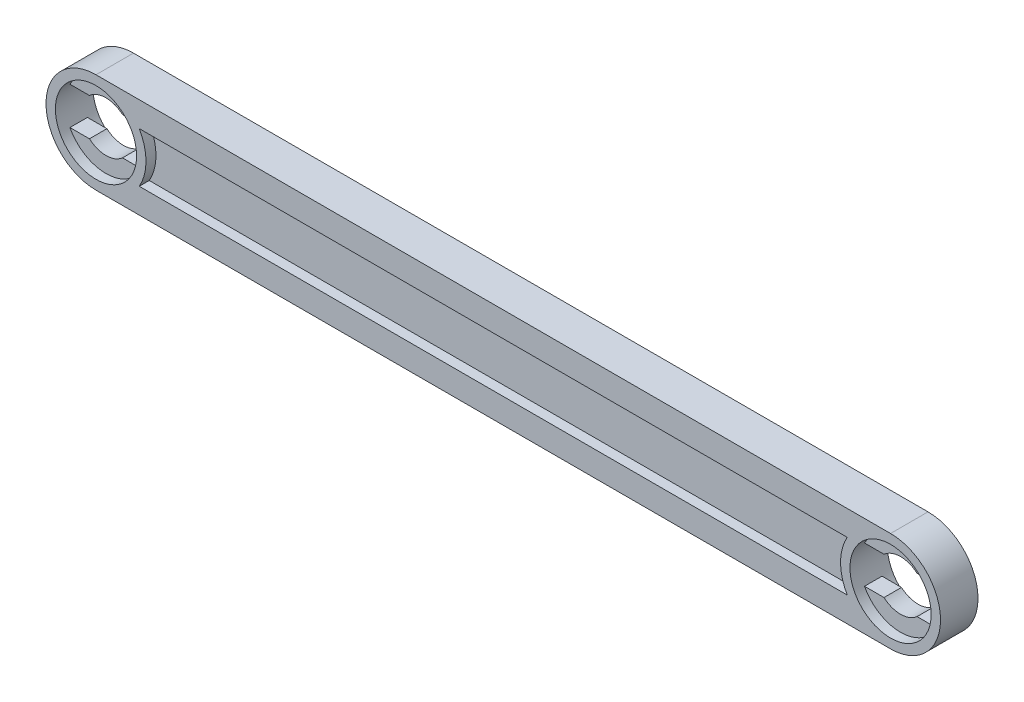
ISO-10303-21;
HEADER;
FILE_DESCRIPTION(('STEP AP214'),'2;1');
FILE_NAME('part.step','',(''),(''),'','','');
FILE_SCHEMA(('AUTOMOTIVE_DESIGN { 1 0 10303 214 1 1 1 1 }'));
ENDSEC;
DATA;
#1=APPLICATION_CONTEXT('core data for automotive mechanical design processes');
#2=APPLICATION_PROTOCOL_DEFINITION('international standard','automotive_design',2000,#1);
#3=PRODUCT_CONTEXT('',#1,'mechanical');
#4=PRODUCT('Part','Part','',(#3));
#5=PRODUCT_RELATED_PRODUCT_CATEGORY('part','',(#4));
#6=PRODUCT_DEFINITION_FORMATION('','',#4);
#7=PRODUCT_DEFINITION_CONTEXT('part definition',#1,'design');
#8=PRODUCT_DEFINITION('design','',#6,#7);
#9=PRODUCT_DEFINITION_SHAPE('','',#8);
#10=(LENGTH_UNIT() NAMED_UNIT(*) SI_UNIT(.MILLI.,.METRE.));
#11=(NAMED_UNIT(*) PLANE_ANGLE_UNIT() SI_UNIT($,.RADIAN.));
#12=(NAMED_UNIT(*) SI_UNIT($,.STERADIAN.) SOLID_ANGLE_UNIT());
#13=UNCERTAINTY_MEASURE_WITH_UNIT(LENGTH_MEASURE(1.E-05),#10,'distance_accuracy_value','');
#14=(GEOMETRIC_REPRESENTATION_CONTEXT(3) GLOBAL_UNCERTAINTY_ASSIGNED_CONTEXT((#13)) GLOBAL_UNIT_ASSIGNED_CONTEXT((#10,
#11,#12)) REPRESENTATION_CONTEXT('',''));
#15=CARTESIAN_POINT('',(0.,0.,0.));
#16=DIRECTION('',(0.,0.,1.));
#17=DIRECTION('',(1.,0.,0.));
#18=AXIS2_PLACEMENT_3D('',#15,#16,#17);
#19=CARTESIAN_POINT('',(0.,0.,-3.));
#20=DIRECTION('',(0.,0.,1.));
#21=DIRECTION('',(1.,0.,0.));
#22=AXIS2_PLACEMENT_3D('',#19,#20,#21);
#23=PLANE('',#22);
#24=DIRECTION('',(0.,-1.,0.));
#25=VECTOR('',#24,1.);
#26=CARTESIAN_POINT('',(59.6,-2.,-3.));
#27=LINE('',#26,#25);
#28=CARTESIAN_POINT('',(59.6,2.,-3.));
#29=VERTEX_POINT('',#28);
#30=CARTESIAN_POINT('',(59.6,-2.,-3.));
#31=VERTEX_POINT('',#30);
#32=EDGE_CURVE('E248',#29,#31,#27,.T.);
#33=ORIENTED_EDGE('',*,*,#32,.F.);
#34=DIRECTION('',(1.,0.,0.));
#35=VECTOR('',#34,1.);
#36=CARTESIAN_POINT('',(59.6,2.,-3.));
#37=LINE('',#36,#35);
#38=CARTESIAN_POINT('',(4.,2.,-3.));
#39=VERTEX_POINT('',#38);
#40=EDGE_CURVE('E49',#39,#29,#37,.T.);
#41=ORIENTED_EDGE('',*,*,#40,.F.);
#42=DIRECTION('',(0.,1.,0.));
#43=VECTOR('',#42,1.);
#44=CARTESIAN_POINT('',(4.00000000000003,-2.,-3.));
#45=LINE('',#44,#43);
#46=CARTESIAN_POINT('',(4.00000000000003,-2.,-3.));
#47=VERTEX_POINT('',#46);
#48=EDGE_CURVE('E239',#47,#39,#45,.T.);
#49=ORIENTED_EDGE('',*,*,#48,.F.);
#50=DIRECTION('',(-1.,0.,0.));
#51=VECTOR('',#50,1.);
#52=CARTESIAN_POINT('',(59.6,-2.,-3.));
#53=LINE('',#52,#51);
#54=EDGE_CURVE('E242',#31,#47,#53,.T.);
#55=ORIENTED_EDGE('',*,*,#54,.F.);
#56=EDGE_LOOP('',(#33,#41,#49,#55));
#57=FACE_BOUND('',#56,.T.);
#58=CARTESIAN_POINT('',(0.,0.,-3.));
#59=DIRECTION('',(0.,0.,1.));
#60=DIRECTION('',(1.,0.,0.));
#61=AXIS2_PLACEMENT_3D('',#58,#59,#60);
#62=CIRCLE('',#61,4.);
#63=CARTESIAN_POINT('',(0.,4.,-3.));
#64=VERTEX_POINT('',#63);
#65=CARTESIAN_POINT('',(0.,-4.,-3.));
#66=VERTEX_POINT('',#65);
#67=EDGE_CURVE('E414',#64,#66,#62,.T.);
#68=ORIENTED_EDGE('',*,*,#67,.F.);
#69=DIRECTION('',(-1.,0.,0.));
#70=VECTOR('',#69,1.);
#71=CARTESIAN_POINT('',(0.,4.,-3.));
#72=LINE('',#71,#70);
#73=CARTESIAN_POINT('',(63.6,4.,-3.));
#74=VERTEX_POINT('',#73);
#75=EDGE_CURVE('E424',#74,#64,#72,.T.);
#76=ORIENTED_EDGE('',*,*,#75,.F.);
#77=CARTESIAN_POINT('',(63.6,0.,-3.));
#78=DIRECTION('',(0.,0.,1.));
#79=DIRECTION('',(1.,0.,0.));
#80=AXIS2_PLACEMENT_3D('',#77,#78,#79);
#81=CIRCLE('',#80,4.);
#82=CARTESIAN_POINT('',(63.6,-4.,-3.));
#83=VERTEX_POINT('',#82);
#84=EDGE_CURVE('E421',#83,#74,#81,.T.);
#85=ORIENTED_EDGE('',*,*,#84,.F.);
#86=DIRECTION('',(1.,0.,0.));
#87=VECTOR('',#86,1.);
#88=CARTESIAN_POINT('',(0.,-4.,-3.));
#89=LINE('',#88,#87);
#90=EDGE_CURVE('E417',#66,#83,#89,.T.);
#91=ORIENTED_EDGE('',*,*,#90,.F.);
#92=EDGE_LOOP('',(#68,#76,#85,#91));
#93=FACE_BOUND('',#92,.T.);
#94=CARTESIAN_POINT('',(0.,0.,-3.));
#95=DIRECTION('',(0.,0.,1.));
#96=DIRECTION('',(1.,0.,0.));
#97=AXIS2_PLACEMENT_3D('',#94,#95,#96);
#98=CIRCLE('',#97,3.25);
#99=CARTESIAN_POINT('',(3.25,0.,-3.));
#100=VERTEX_POINT('',#99);
#101=EDGE_CURVE('E391',#100,#100,#98,.F.);
#102=ORIENTED_EDGE('',*,*,#101,.F.);
#103=EDGE_LOOP('',(#102));
#104=FACE_BOUND('',#103,.T.);
#105=CARTESIAN_POINT('',(63.6,0.,-3.));
#106=DIRECTION('',(0.,0.,1.));
#107=DIRECTION('',(1.,0.,0.));
#108=AXIS2_PLACEMENT_3D('',#105,#106,#107);
#109=CIRCLE('',#108,3.25);
#110=CARTESIAN_POINT('',(66.85,0.,-3.));
#111=VERTEX_POINT('',#110);
#112=EDGE_CURVE('E328',#111,#111,#109,.F.);
#113=ORIENTED_EDGE('',*,*,#112,.F.);
#114=EDGE_LOOP('',(#113));
#115=FACE_BOUND('',#114,.T.);
#116=ADVANCED_FACE('F34',(#57,#93,#104,#115),#23,.F.);
#117=CARTESIAN_POINT('',(60.7168593513323,1.5,-3.001));
#118=DIRECTION('',(0.,1.,0.));
#119=DIRECTION('',(0.,0.,1.));
#120=AXIS2_PLACEMENT_3D('',#117,#118,#119);
#121=PLANE('',#120);
#122=DIRECTION('',(0.,0.,1.));
#123=VECTOR('',#122,1.);
#124=CARTESIAN_POINT('',(60.7168593513323,1.5,-3.001));
#125=LINE('',#124,#123);
#126=CARTESIAN_POINT('',(60.7168593513323,1.5,-2.2));
#127=VERTEX_POINT('',#126);
#128=CARTESIAN_POINT('',(60.7168593513323,1.5,-0.8));
#129=VERTEX_POINT('',#128);
#130=EDGE_CURVE('E335',#127,#129,#125,.T.);
#131=ORIENTED_EDGE('',*,*,#130,.F.);
#132=DIRECTION('',(1.,0.,0.));
#133=VECTOR('',#132,1.);
#134=CARTESIAN_POINT('',(60.7168593513323,1.5,-2.2));
#135=LINE('',#134,#133);
#136=CARTESIAN_POINT('',(62.2771243444677,1.5,-2.2));
#137=VERTEX_POINT('',#136);
#138=EDGE_CURVE('E306',#127,#137,#135,.T.);
#139=ORIENTED_EDGE('',*,*,#138,.T.);
#140=DIRECTION('',(0.,0.,1.));
#141=VECTOR('',#140,1.);
#142=CARTESIAN_POINT('',(62.2771243444677,1.5,-3.001));
#143=LINE('',#142,#141);
#144=CARTESIAN_POINT('',(62.2771243444677,1.5,-0.8));
#145=VERTEX_POINT('',#144);
#146=EDGE_CURVE('E338',#137,#145,#143,.T.);
#147=ORIENTED_EDGE('',*,*,#146,.T.);
#148=DIRECTION('',(1.,0.,0.));
#149=VECTOR('',#148,1.);
#150=CARTESIAN_POINT('',(60.7168593513323,1.5,-0.8));
#151=LINE('',#150,#149);
#152=EDGE_CURVE('E325',#129,#145,#151,.T.);
#153=ORIENTED_EDGE('',*,*,#152,.F.);
#154=EDGE_LOOP('',(#131,#139,#147,#153));
#155=FACE_BOUND('',#154,.T.);
#156=ADVANCED_FACE('F483',(#155),#121,.F.);
#157=CARTESIAN_POINT('',(63.6,0.,-3.001));
#158=DIRECTION('',(0.,0.,1.));
#159=DIRECTION('',(1.,0.,0.));
#160=AXIS2_PLACEMENT_3D('',#157,#158,#159);
#161=CYLINDRICAL_SURFACE('',#160,2.);
#162=ORIENTED_EDGE('',*,*,#146,.F.);
#163=CARTESIAN_POINT('',(63.6,0.,-2.2));
#164=DIRECTION('',(0.,0.,1.));
#165=DIRECTION('',(1.,0.,0.));
#166=AXIS2_PLACEMENT_3D('',#163,#164,#165);
#167=CIRCLE('',#166,2.);
#168=CARTESIAN_POINT('',(64.9228756555323,1.5,-2.2));
#169=VERTEX_POINT('',#168);
#170=EDGE_CURVE('E303',#137,#169,#167,.F.);
#171=ORIENTED_EDGE('',*,*,#170,.T.);
#172=DIRECTION('',(0.,0.,1.));
#173=VECTOR('',#172,1.);
#174=CARTESIAN_POINT('',(64.9228756555323,1.5,-3.001));
#175=LINE('',#174,#173);
#176=CARTESIAN_POINT('',(64.9228756555323,1.5,-0.800000000000001));
#177=VERTEX_POINT('',#176);
#178=EDGE_CURVE('E340',#169,#177,#175,.T.);
#179=ORIENTED_EDGE('',*,*,#178,.T.);
#180=CARTESIAN_POINT('',(63.6,0.,-0.8));
#181=DIRECTION('',(0.,0.,1.));
#182=DIRECTION('',(1.,0.,0.));
#183=AXIS2_PLACEMENT_3D('',#180,#181,#182);
#184=CIRCLE('',#183,2.);
#185=EDGE_CURVE('E322',#145,#177,#184,.F.);
#186=ORIENTED_EDGE('',*,*,#185,.F.);
#187=EDGE_LOOP('',(#162,#171,#179,#186));
#188=FACE_BOUND('',#187,.T.);
#189=ADVANCED_FACE('F489',(#188),#161,.F.);
#190=CARTESIAN_POINT('',(64.9228756555323,1.5,-3.001));
#191=DIRECTION('',(0.,1.,0.));
#192=DIRECTION('',(0.,0.,1.));
#193=AXIS2_PLACEMENT_3D('',#190,#191,#192);
#194=PLANE('',#193);
#195=ORIENTED_EDGE('',*,*,#178,.F.);
#196=DIRECTION('',(1.,0.,0.));
#197=VECTOR('',#196,1.);
#198=CARTESIAN_POINT('',(64.9228756555323,1.5,-2.2));
#199=LINE('',#198,#197);
#200=CARTESIAN_POINT('',(66.4831406486677,1.5,-2.2));
#201=VERTEX_POINT('',#200);
#202=EDGE_CURVE('E300',#169,#201,#199,.T.);
#203=ORIENTED_EDGE('',*,*,#202,.T.);
#204=DIRECTION('',(0.,0.,1.));
#205=VECTOR('',#204,1.);
#206=CARTESIAN_POINT('',(66.4831406486677,1.5,-3.001));
#207=LINE('',#206,#205);
#208=CARTESIAN_POINT('',(66.4831406486677,1.5,-0.8));
#209=VERTEX_POINT('',#208);
#210=EDGE_CURVE('E342',#201,#209,#207,.T.);
#211=ORIENTED_EDGE('',*,*,#210,.T.);
#212=DIRECTION('',(1.,0.,0.));
#213=VECTOR('',#212,1.);
#214=CARTESIAN_POINT('',(64.9228756555323,1.5,-0.8));
#215=LINE('',#214,#213);
#216=EDGE_CURVE('E319',#177,#209,#215,.T.);
#217=ORIENTED_EDGE('',*,*,#216,.F.);
#218=EDGE_LOOP('',(#195,#203,#211,#217));
#219=FACE_BOUND('',#218,.T.);
#220=ADVANCED_FACE('F660',(#219),#194,.F.);
#221=CARTESIAN_POINT('',(64.9228756555323,-1.5,-3.001));
#222=DIRECTION('',(0.,-1.,0.));
#223=DIRECTION('',(0.,0.,-1.));
#224=AXIS2_PLACEMENT_3D('',#221,#222,#223);
#225=PLANE('',#224);
#226=DIRECTION('',(0.,0.,1.));
#227=VECTOR('',#226,1.);
#228=CARTESIAN_POINT('',(66.4831406486677,-1.5,-3.001));
#229=LINE('',#228,#227);
#230=CARTESIAN_POINT('',(66.4831406486677,-1.5,-2.2));
#231=VERTEX_POINT('',#230);
#232=CARTESIAN_POINT('',(66.4831406486677,-1.5,-0.8));
#233=VERTEX_POINT('',#232);
#234=EDGE_CURVE('E344',#231,#233,#229,.T.);
#235=ORIENTED_EDGE('',*,*,#234,.F.);
#236=DIRECTION('',(-1.,0.,0.));
#237=VECTOR('',#236,1.);
#238=CARTESIAN_POINT('',(64.9228756555323,-1.5,-2.2));
#239=LINE('',#238,#237);
#240=CARTESIAN_POINT('',(64.9228756555323,-1.5,-2.2));
#241=VERTEX_POINT('',#240);
#242=EDGE_CURVE('E297',#231,#241,#239,.T.);
#243=ORIENTED_EDGE('',*,*,#242,.T.);
#244=DIRECTION('',(0.,0.,1.));
#245=VECTOR('',#244,1.);
#246=CARTESIAN_POINT('',(64.9228756555323,-1.5,-3.001));
#247=LINE('',#246,#245);
#248=CARTESIAN_POINT('',(64.9228756555323,-1.5,-0.8));
#249=VERTEX_POINT('',#248);
#250=EDGE_CURVE('E346',#241,#249,#247,.T.);
#251=ORIENTED_EDGE('',*,*,#250,.T.);
#252=DIRECTION('',(-1.,0.,0.));
#253=VECTOR('',#252,1.);
#254=CARTESIAN_POINT('',(64.9228756555323,-1.5,-0.8));
#255=LINE('',#254,#253);
#256=EDGE_CURVE('E316',#233,#249,#255,.T.);
#257=ORIENTED_EDGE('',*,*,#256,.F.);
#258=EDGE_LOOP('',(#235,#243,#251,#257));
#259=FACE_BOUND('',#258,.T.);
#260=ADVANCED_FACE('F670',(#259),#225,.F.);
#261=CARTESIAN_POINT('',(63.6,0.,-3.001));
#262=DIRECTION('',(0.,0.,1.));
#263=DIRECTION('',(1.,0.,0.));
#264=AXIS2_PLACEMENT_3D('',#261,#262,#263);
#265=CYLINDRICAL_SURFACE('',#264,2.);
#266=ORIENTED_EDGE('',*,*,#250,.F.);
#267=CARTESIAN_POINT('',(63.6,0.,-2.2));
#268=DIRECTION('',(0.,0.,1.));
#269=DIRECTION('',(1.,0.,0.));
#270=AXIS2_PLACEMENT_3D('',#267,#268,#269);
#271=CIRCLE('',#270,2.);
#272=CARTESIAN_POINT('',(62.2771243444677,-1.5,-2.2));
#273=VERTEX_POINT('',#272);
#274=EDGE_CURVE('E294',#241,#273,#271,.F.);
#275=ORIENTED_EDGE('',*,*,#274,.T.);
#276=DIRECTION('',(0.,0.,1.));
#277=VECTOR('',#276,1.);
#278=CARTESIAN_POINT('',(62.2771243444677,-1.5,-3.001));
#279=LINE('',#278,#277);
#280=CARTESIAN_POINT('',(62.2771243444677,-1.5,-0.800000000000001));
#281=VERTEX_POINT('',#280);
#282=EDGE_CURVE('E348',#273,#281,#279,.T.);
#283=ORIENTED_EDGE('',*,*,#282,.T.);
#284=CARTESIAN_POINT('',(63.6,0.,-0.8));
#285=DIRECTION('',(0.,0.,1.));
#286=DIRECTION('',(1.,0.,0.));
#287=AXIS2_PLACEMENT_3D('',#284,#285,#286);
#288=CIRCLE('',#287,2.);
#289=EDGE_CURVE('E313',#249,#281,#288,.F.);
#290=ORIENTED_EDGE('',*,*,#289,.F.);
#291=EDGE_LOOP('',(#266,#275,#283,#290));
#292=FACE_BOUND('',#291,.T.);
#293=ADVANCED_FACE('F680',(#292),#265,.F.);
#294=CARTESIAN_POINT('',(60.7168593513323,-1.5,-3.001));
#295=DIRECTION('',(0.,-1.,0.));
#296=DIRECTION('',(0.,0.,-1.));
#297=AXIS2_PLACEMENT_3D('',#294,#295,#296);
#298=PLANE('',#297);
#299=ORIENTED_EDGE('',*,*,#282,.F.);
#300=DIRECTION('',(-1.,0.,0.));
#301=VECTOR('',#300,1.);
#302=CARTESIAN_POINT('',(60.7168593513323,-1.5,-2.2));
#303=LINE('',#302,#301);
#304=CARTESIAN_POINT('',(60.7168593513323,-1.5,-2.2));
#305=VERTEX_POINT('',#304);
#306=EDGE_CURVE('E291',#273,#305,#303,.T.);
#307=ORIENTED_EDGE('',*,*,#306,.T.);
#308=DIRECTION('',(0.,0.,1.));
#309=VECTOR('',#308,1.);
#310=CARTESIAN_POINT('',(60.7168593513323,-1.5,-3.001));
#311=LINE('',#310,#309);
#312=CARTESIAN_POINT('',(60.7168593513323,-1.5,-0.8));
#313=VERTEX_POINT('',#312);
#314=EDGE_CURVE('E334',#305,#313,#311,.T.);
#315=ORIENTED_EDGE('',*,*,#314,.T.);
#316=DIRECTION('',(-1.,0.,0.));
#317=VECTOR('',#316,1.);
#318=CARTESIAN_POINT('',(60.7168593513323,-1.5,-0.8));
#319=LINE('',#318,#317);
#320=EDGE_CURVE('E11',#281,#313,#319,.T.);
#321=ORIENTED_EDGE('',*,*,#320,.F.);
#322=EDGE_LOOP('',(#299,#307,#315,#321));
#323=FACE_BOUND('',#322,.T.);
#324=ADVANCED_FACE('F602',(#323),#298,.F.);
#325=CARTESIAN_POINT('',(-2.8831406486677,1.5,-3.001));
#326=DIRECTION('',(0.,1.,0.));
#327=DIRECTION('',(0.,0.,1.));
#328=AXIS2_PLACEMENT_3D('',#325,#326,#327);
#329=PLANE('',#328);
#330=DIRECTION('',(0.,0.,1.));
#331=VECTOR('',#330,1.);
#332=CARTESIAN_POINT('',(-2.8831406486677,1.5,-3.001));
#333=LINE('',#332,#331);
#334=CARTESIAN_POINT('',(-2.8831406486677,1.5,-2.2));
#335=VERTEX_POINT('',#334);
#336=CARTESIAN_POINT('',(-2.8831406486677,1.5,-0.8));
#337=VERTEX_POINT('',#336);
#338=EDGE_CURVE('E398',#335,#337,#333,.T.);
#339=ORIENTED_EDGE('',*,*,#338,.F.);
#340=DIRECTION('',(1.,0.,0.));
#341=VECTOR('',#340,1.);
#342=CARTESIAN_POINT('',(-2.8831406486677,1.5,-2.2));
#343=LINE('',#342,#341);
#344=CARTESIAN_POINT('',(-1.3228756555323,1.5,-2.2));
#345=VERTEX_POINT('',#344);
#346=EDGE_CURVE('E369',#335,#345,#343,.T.);
#347=ORIENTED_EDGE('',*,*,#346,.T.);
#348=DIRECTION('',(0.,0.,1.));
#349=VECTOR('',#348,1.);
#350=CARTESIAN_POINT('',(-1.3228756555323,1.5,-3.001));
#351=LINE('',#350,#349);
#352=CARTESIAN_POINT('',(-1.3228756555323,1.5,-0.8));
#353=VERTEX_POINT('',#352);
#354=EDGE_CURVE('E401',#345,#353,#351,.T.);
#355=ORIENTED_EDGE('',*,*,#354,.T.);
#356=DIRECTION('',(1.,0.,0.));
#357=VECTOR('',#356,1.);
#358=CARTESIAN_POINT('',(-2.8831406486677,1.5,-0.8));
#359=LINE('',#358,#357);
#360=EDGE_CURVE('E388',#337,#353,#359,.T.);
#361=ORIENTED_EDGE('',*,*,#360,.F.);
#362=EDGE_LOOP('',(#339,#347,#355,#361));
#363=FACE_BOUND('',#362,.T.);
#364=ADVANCED_FACE('F538',(#363),#329,.F.);
#365=CARTESIAN_POINT('',(0.,0.,-3.001));
#366=DIRECTION('',(0.,0.,1.));
#367=DIRECTION('',(1.,0.,0.));
#368=AXIS2_PLACEMENT_3D('',#365,#366,#367);
#369=CYLINDRICAL_SURFACE('',#368,2.);
#370=ORIENTED_EDGE('',*,*,#354,.F.);
#371=CARTESIAN_POINT('',(0.,0.,-2.2));
#372=DIRECTION('',(0.,0.,1.));
#373=DIRECTION('',(1.,0.,0.));
#374=AXIS2_PLACEMENT_3D('',#371,#372,#373);
#375=CIRCLE('',#374,2.);
#376=CARTESIAN_POINT('',(1.3228756555323,1.5,-2.2));
#377=VERTEX_POINT('',#376);
#378=EDGE_CURVE('E366',#345,#377,#375,.F.);
#379=ORIENTED_EDGE('',*,*,#378,.T.);
#380=DIRECTION('',(0.,0.,1.));
#381=VECTOR('',#380,1.);
#382=CARTESIAN_POINT('',(1.3228756555323,1.5,-3.001));
#383=LINE('',#382,#381);
#384=CARTESIAN_POINT('',(1.3228756555323,1.5,-0.800000000000001));
#385=VERTEX_POINT('',#384);
#386=EDGE_CURVE('E403',#377,#385,#383,.T.);
#387=ORIENTED_EDGE('',*,*,#386,.T.);
#388=CARTESIAN_POINT('',(0.,0.,-0.8));
#389=DIRECTION('',(0.,0.,1.));
#390=DIRECTION('',(1.,0.,0.));
#391=AXIS2_PLACEMENT_3D('',#388,#389,#390);
#392=CIRCLE('',#391,2.);
#393=EDGE_CURVE('E385',#353,#385,#392,.F.);
#394=ORIENTED_EDGE('',*,*,#393,.F.);
#395=EDGE_LOOP('',(#370,#379,#387,#394));
#396=FACE_BOUND('',#395,.T.);
#397=ADVANCED_FACE('F544',(#396),#369,.F.);
#398=CARTESIAN_POINT('',(1.3228756555323,1.5,-3.001));
#399=DIRECTION('',(0.,1.,0.));
#400=DIRECTION('',(0.,0.,1.));
#401=AXIS2_PLACEMENT_3D('',#398,#399,#400);
#402=PLANE('',#401);
#403=ORIENTED_EDGE('',*,*,#386,.F.);
#404=DIRECTION('',(1.,0.,0.));
#405=VECTOR('',#404,1.);
#406=CARTESIAN_POINT('',(1.3228756555323,1.5,-2.2));
#407=LINE('',#406,#405);
#408=CARTESIAN_POINT('',(2.8831406486677,1.5,-2.2));
#409=VERTEX_POINT('',#408);
#410=EDGE_CURVE('E363',#377,#409,#407,.T.);
#411=ORIENTED_EDGE('',*,*,#410,.T.);
#412=DIRECTION('',(0.,0.,1.));
#413=VECTOR('',#412,1.);
#414=CARTESIAN_POINT('',(2.8831406486677,1.5,-3.001));
#415=LINE('',#414,#413);
#416=CARTESIAN_POINT('',(2.8831406486677,1.5,-0.8));
#417=VERTEX_POINT('',#416);
#418=EDGE_CURVE('E405',#409,#417,#415,.T.);
#419=ORIENTED_EDGE('',*,*,#418,.T.);
#420=DIRECTION('',(1.,0.,0.));
#421=VECTOR('',#420,1.);
#422=CARTESIAN_POINT('',(1.3228756555323,1.5,-0.8));
#423=LINE('',#422,#421);
#424=EDGE_CURVE('E382',#385,#417,#423,.T.);
#425=ORIENTED_EDGE('',*,*,#424,.F.);
#426=EDGE_LOOP('',(#403,#411,#419,#425));
#427=FACE_BOUND('',#426,.T.);
#428=ADVANCED_FACE('F547',(#427),#402,.F.);
#429=CARTESIAN_POINT('',(1.3228756555323,-1.5,-3.001));
#430=DIRECTION('',(0.,-1.,0.));
#431=DIRECTION('',(0.,0.,-1.));
#432=AXIS2_PLACEMENT_3D('',#429,#430,#431);
#433=PLANE('',#432);
#434=DIRECTION('',(0.,0.,1.));
#435=VECTOR('',#434,1.);
#436=CARTESIAN_POINT('',(2.8831406486677,-1.5,-3.001));
#437=LINE('',#436,#435);
#438=CARTESIAN_POINT('',(2.8831406486677,-1.5,-2.2));
#439=VERTEX_POINT('',#438);
#440=CARTESIAN_POINT('',(2.8831406486677,-1.5,-0.8));
#441=VERTEX_POINT('',#440);
#442=EDGE_CURVE('E407',#439,#441,#437,.T.);
#443=ORIENTED_EDGE('',*,*,#442,.F.);
#444=DIRECTION('',(-1.,0.,0.));
#445=VECTOR('',#444,1.);
#446=CARTESIAN_POINT('',(1.3228756555323,-1.5,-2.2));
#447=LINE('',#446,#445);
#448=CARTESIAN_POINT('',(1.32287565553229,-1.5,-2.2));
#449=VERTEX_POINT('',#448);
#450=EDGE_CURVE('E360',#439,#449,#447,.T.);
#451=ORIENTED_EDGE('',*,*,#450,.T.);
#452=DIRECTION('',(0.,0.,1.));
#453=VECTOR('',#452,1.);
#454=CARTESIAN_POINT('',(1.32287565553229,-1.5,-3.001));
#455=LINE('',#454,#453);
#456=CARTESIAN_POINT('',(1.32287565553229,-1.5,-0.8));
#457=VERTEX_POINT('',#456);
#458=EDGE_CURVE('E409',#449,#457,#455,.T.);
#459=ORIENTED_EDGE('',*,*,#458,.T.);
#460=DIRECTION('',(-1.,0.,0.));
#461=VECTOR('',#460,1.);
#462=CARTESIAN_POINT('',(1.3228756555323,-1.5,-0.8));
#463=LINE('',#462,#461);
#464=EDGE_CURVE('E379',#441,#457,#463,.T.);
#465=ORIENTED_EDGE('',*,*,#464,.F.);
#466=EDGE_LOOP('',(#443,#451,#459,#465));
#467=FACE_BOUND('',#466,.T.);
#468=ADVANCED_FACE('F461',(#467),#433,.F.);
#469=CARTESIAN_POINT('',(0.,0.,-3.001));
#470=DIRECTION('',(0.,0.,1.));
#471=DIRECTION('',(1.,0.,0.));
#472=AXIS2_PLACEMENT_3D('',#469,#470,#471);
#473=CYLINDRICAL_SURFACE('',#472,2.);
#474=ORIENTED_EDGE('',*,*,#458,.F.);
#475=CARTESIAN_POINT('',(0.,0.,-2.2));
#476=DIRECTION('',(0.,0.,1.));
#477=DIRECTION('',(1.,0.,0.));
#478=AXIS2_PLACEMENT_3D('',#475,#476,#477);
#479=CIRCLE('',#478,2.);
#480=CARTESIAN_POINT('',(-1.3228756555323,-1.5,-2.2));
#481=VERTEX_POINT('',#480);
#482=EDGE_CURVE('E357',#449,#481,#479,.F.);
#483=ORIENTED_EDGE('',*,*,#482,.T.);
#484=DIRECTION('',(0.,0.,1.));
#485=VECTOR('',#484,1.);
#486=CARTESIAN_POINT('',(-1.3228756555323,-1.5,-3.001));
#487=LINE('',#486,#485);
#488=CARTESIAN_POINT('',(-1.3228756555323,-1.5,-0.800000000000001));
#489=VERTEX_POINT('',#488);
#490=EDGE_CURVE('E411',#481,#489,#487,.T.);
#491=ORIENTED_EDGE('',*,*,#490,.T.);
#492=CARTESIAN_POINT('',(0.,0.,-0.8));
#493=DIRECTION('',(0.,0.,1.));
#494=DIRECTION('',(1.,0.,0.));
#495=AXIS2_PLACEMENT_3D('',#492,#493,#494);
#496=CIRCLE('',#495,2.);
#497=EDGE_CURVE('E376',#457,#489,#496,.F.);
#498=ORIENTED_EDGE('',*,*,#497,.F.);
#499=EDGE_LOOP('',(#474,#483,#491,#498));
#500=FACE_BOUND('',#499,.T.);
#501=ADVANCED_FACE('F464',(#500),#473,.F.);
#502=CARTESIAN_POINT('',(-2.8831406486677,-1.5,-3.001));
#503=DIRECTION('',(0.,-1.,0.));
#504=DIRECTION('',(0.,0.,-1.));
#505=AXIS2_PLACEMENT_3D('',#502,#503,#504);
#506=PLANE('',#505);
#507=ORIENTED_EDGE('',*,*,#490,.F.);
#508=DIRECTION('',(-1.,0.,0.));
#509=VECTOR('',#508,1.);
#510=CARTESIAN_POINT('',(-2.8831406486677,-1.5,-2.2));
#511=LINE('',#510,#509);
#512=CARTESIAN_POINT('',(-2.8831406486677,-1.5,-2.2));
#513=VERTEX_POINT('',#512);
#514=EDGE_CURVE('E354',#481,#513,#511,.T.);
#515=ORIENTED_EDGE('',*,*,#514,.T.);
#516=DIRECTION('',(0.,0.,1.));
#517=VECTOR('',#516,1.);
#518=CARTESIAN_POINT('',(-2.8831406486677,-1.5,-3.001));
#519=LINE('',#518,#517);
#520=CARTESIAN_POINT('',(-2.8831406486677,-1.5,-0.8));
#521=VERTEX_POINT('',#520);
#522=EDGE_CURVE('E397',#513,#521,#519,.T.);
#523=ORIENTED_EDGE('',*,*,#522,.T.);
#524=DIRECTION('',(-1.,0.,0.));
#525=VECTOR('',#524,1.);
#526=CARTESIAN_POINT('',(-2.8831406486677,-1.5,-0.8));
#527=LINE('',#526,#525);
#528=EDGE_CURVE('E42',#489,#521,#527,.T.);
#529=ORIENTED_EDGE('',*,*,#528,.F.);
#530=EDGE_LOOP('',(#507,#515,#523,#529));
#531=FACE_BOUND('',#530,.T.);
#532=ADVANCED_FACE('F465',(#531),#506,.F.);
#533=CARTESIAN_POINT('',(0.,0.,-3.));
#534=DIRECTION('',(0.,0.,1.));
#535=DIRECTION('',(1.,0.,0.));
#536=AXIS2_PLACEMENT_3D('',#533,#534,#535);
#537=CYLINDRICAL_SURFACE('',#536,4.);
#538=CARTESIAN_POINT('',(0.,0.,0.));
#539=DIRECTION('',(0.,0.,1.));
#540=DIRECTION('',(1.,0.,0.));
#541=AXIS2_PLACEMENT_3D('',#538,#539,#540);
#542=CIRCLE('',#541,4.);
#543=CARTESIAN_POINT('',(0.,4.,0.));
#544=VERTEX_POINT('',#543);
#545=CARTESIAN_POINT('',(0.,-4.,0.));
#546=VERTEX_POINT('',#545);
#547=EDGE_CURVE('E400',#544,#546,#542,.T.);
#548=ORIENTED_EDGE('',*,*,#547,.F.);
#549=DIRECTION('',(0.,0.,1.));
#550=VECTOR('',#549,1.);
#551=CARTESIAN_POINT('',(0.,4.,-3.));
#552=LINE('',#551,#550);
#553=EDGE_CURVE('E438',#64,#544,#552,.T.);
#554=ORIENTED_EDGE('',*,*,#553,.F.);
#555=ORIENTED_EDGE('',*,*,#67,.T.);
#556=DIRECTION('',(0.,0.,1.));
#557=VECTOR('',#556,1.);
#558=CARTESIAN_POINT('',(0.,-4.,-3.));
#559=LINE('',#558,#557);
#560=EDGE_CURVE('E427',#66,#546,#559,.T.);
#561=ORIENTED_EDGE('',*,*,#560,.T.);
#562=EDGE_LOOP('',(#548,#554,#555,#561));
#563=FACE_BOUND('',#562,.T.);
#564=ADVANCED_FACE('F36',(#563),#537,.T.);
#565=CARTESIAN_POINT('',(0.,4.,-3.));
#566=DIRECTION('',(0.,1.,0.));
#567=DIRECTION('',(0.,0.,1.));
#568=AXIS2_PLACEMENT_3D('',#565,#566,#567);
#569=PLANE('',#568);
#570=DIRECTION('',(-1.,0.,0.));
#571=VECTOR('',#570,1.);
#572=CARTESIAN_POINT('',(0.,4.,0.));
#573=LINE('',#572,#571);
#574=CARTESIAN_POINT('',(63.6,4.,0.));
#575=VERTEX_POINT('',#574);
#576=EDGE_CURVE('E418',#575,#544,#573,.T.);
#577=ORIENTED_EDGE('',*,*,#576,.F.);
#578=DIRECTION('',(0.,0.,1.));
#579=VECTOR('',#578,1.);
#580=CARTESIAN_POINT('',(63.6,4.,-3.));
#581=LINE('',#580,#579);
#582=EDGE_CURVE('E440',#74,#575,#581,.T.);
#583=ORIENTED_EDGE('',*,*,#582,.F.);
#584=ORIENTED_EDGE('',*,*,#75,.T.);
#585=ORIENTED_EDGE('',*,*,#553,.T.);
#586=EDGE_LOOP('',(#577,#583,#584,#585));
#587=FACE_BOUND('',#586,.T.);
#588=ADVANCED_FACE('F501',(#587),#569,.T.);
#589=CARTESIAN_POINT('',(63.6,0.,-3.));
#590=DIRECTION('',(0.,0.,1.));
#591=DIRECTION('',(1.,0.,0.));
#592=AXIS2_PLACEMENT_3D('',#589,#590,#591);
#593=CYLINDRICAL_SURFACE('',#592,4.);
#594=CARTESIAN_POINT('',(63.6,0.,0.));
#595=DIRECTION('',(0.,0.,1.));
#596=DIRECTION('',(1.,0.,0.));
#597=AXIS2_PLACEMENT_3D('',#594,#595,#596);
#598=CIRCLE('',#597,4.);
#599=CARTESIAN_POINT('',(63.6,-4.,0.));
#600=VERTEX_POINT('',#599);
#601=EDGE_CURVE('E433',#600,#575,#598,.T.);
#602=ORIENTED_EDGE('',*,*,#601,.F.);
#603=DIRECTION('',(0.,0.,1.));
#604=VECTOR('',#603,1.);
#605=CARTESIAN_POINT('',(63.6,-4.,-3.));
#606=LINE('',#605,#604);
#607=EDGE_CURVE('E442',#83,#600,#606,.T.);
#608=ORIENTED_EDGE('',*,*,#607,.F.);
#609=ORIENTED_EDGE('',*,*,#84,.T.);
#610=ORIENTED_EDGE('',*,*,#582,.T.);
#611=EDGE_LOOP('',(#602,#608,#609,#610));
#612=FACE_BOUND('',#611,.T.);
#613=ADVANCED_FACE('F504',(#612),#593,.T.);
#614=CARTESIAN_POINT('',(0.,-4.,-3.));
#615=DIRECTION('',(0.,-1.,0.));
#616=DIRECTION('',(0.,0.,-1.));
#617=AXIS2_PLACEMENT_3D('',#614,#615,#616);
#618=PLANE('',#617);
#619=DIRECTION('',(1.,0.,0.));
#620=VECTOR('',#619,1.);
#621=CARTESIAN_POINT('',(0.,-4.,0.));
#622=LINE('',#621,#620);
#623=EDGE_CURVE('E430',#546,#600,#622,.T.);
#624=ORIENTED_EDGE('',*,*,#623,.F.);
#625=ORIENTED_EDGE('',*,*,#560,.F.);
#626=ORIENTED_EDGE('',*,*,#90,.T.);
#627=ORIENTED_EDGE('',*,*,#607,.T.);
#628=EDGE_LOOP('',(#624,#625,#626,#627));
#629=FACE_BOUND('',#628,.T.);
#630=ADVANCED_FACE('F499',(#629),#618,.T.);
#631=CARTESIAN_POINT('',(0.,0.,0.));
#632=DIRECTION('',(0.,0.,1.));
#633=DIRECTION('',(1.,0.,0.));
#634=AXIS2_PLACEMENT_3D('',#631,#632,#633);
#635=PLANE('',#634);
#636=CARTESIAN_POINT('',(0.,0.,0.));
#637=DIRECTION('',(0.,0.,-1.));
#638=DIRECTION('',(1.,0.,0.));
#639=AXIS2_PLACEMENT_3D('',#636,#637,#638);
#640=CIRCLE('',#639,4.);
#641=CARTESIAN_POINT('',(3.46410161513775,2.,0.));
#642=VERTEX_POINT('',#641);
#643=CARTESIAN_POINT('',(3.46410161513775,-2.,0.));
#644=VERTEX_POINT('',#643);
#645=EDGE_CURVE('E57',#642,#644,#640,.T.);
#646=ORIENTED_EDGE('',*,*,#645,.F.);
#647=DIRECTION('',(-1.,0.,0.));
#648=VECTOR('',#647,1.);
#649=CARTESIAN_POINT('',(3.46410161513775,2.,0.));
#650=LINE('',#649,#648);
#651=CARTESIAN_POINT('',(60.1358983848622,2.,0.));
#652=VERTEX_POINT('',#651);
#653=EDGE_CURVE('E261',#652,#642,#650,.T.);
#654=ORIENTED_EDGE('',*,*,#653,.F.);
#655=CARTESIAN_POINT('',(63.6,0.,0.));
#656=DIRECTION('',(0.,0.,-1.));
#657=DIRECTION('',(1.,0.,0.));
#658=AXIS2_PLACEMENT_3D('',#655,#656,#657);
#659=CIRCLE('',#658,4.00000000000001);
#660=CARTESIAN_POINT('',(60.1358983848622,-2.,0.));
#661=VERTEX_POINT('',#660);
#662=EDGE_CURVE('E275',#661,#652,#659,.T.);
#663=ORIENTED_EDGE('',*,*,#662,.F.);
#664=DIRECTION('',(1.,0.,0.));
#665=VECTOR('',#664,1.);
#666=CARTESIAN_POINT('',(3.46410161513775,-2.,0.));
#667=LINE('',#666,#665);
#668=EDGE_CURVE('E272',#644,#661,#667,.T.);
#669=ORIENTED_EDGE('',*,*,#668,.F.);
#670=EDGE_LOOP('',(#646,#654,#663,#669));
#671=FACE_BOUND('',#670,.T.);
#672=CARTESIAN_POINT('',(63.6,0.,0.));
#673=DIRECTION('',(0.,0.,1.));
#674=DIRECTION('',(1.,0.,0.));
#675=AXIS2_PLACEMENT_3D('',#672,#673,#674);
#676=CIRCLE('',#675,3.25);
#677=CARTESIAN_POINT('',(66.85,0.,0.));
#678=VERTEX_POINT('',#677);
#679=EDGE_CURVE('E331',#678,#678,#676,.T.);
#680=ORIENTED_EDGE('',*,*,#679,.F.);
#681=EDGE_LOOP('',(#680));
#682=FACE_BOUND('',#681,.T.);
#683=CARTESIAN_POINT('',(0.,0.,0.));
#684=DIRECTION('',(0.,0.,1.));
#685=DIRECTION('',(1.,0.,0.));
#686=AXIS2_PLACEMENT_3D('',#683,#684,#685);
#687=CIRCLE('',#686,3.25);
#688=CARTESIAN_POINT('',(3.25,0.,0.));
#689=VERTEX_POINT('',#688);
#690=EDGE_CURVE('E394',#689,#689,#687,.T.);
#691=ORIENTED_EDGE('',*,*,#690,.F.);
#692=EDGE_LOOP('',(#691));
#693=FACE_BOUND('',#692,.T.);
#694=ORIENTED_EDGE('',*,*,#547,.T.);
#695=ORIENTED_EDGE('',*,*,#623,.T.);
#696=ORIENTED_EDGE('',*,*,#601,.T.);
#697=ORIENTED_EDGE('',*,*,#576,.T.);
#698=EDGE_LOOP('',(#694,#695,#696,#697));
#699=FACE_BOUND('',#698,.T.);
#700=ADVANCED_FACE('F496',(#671,#682,#693,#699),#635,.T.);
#701=CARTESIAN_POINT('',(0.,0.,-3.001));
#702=DIRECTION('',(0.,0.,1.));
#703=DIRECTION('',(1.,0.,0.));
#704=AXIS2_PLACEMENT_3D('',#701,#702,#703);
#705=CYLINDRICAL_SURFACE('',#704,3.25);
#706=CARTESIAN_POINT('',(0.,0.,-2.2));
#707=DIRECTION('',(0.,0.,1.));
#708=DIRECTION('',(1.,0.,0.));
#709=AXIS2_PLACEMENT_3D('',#706,#707,#708);
#710=CIRCLE('',#709,3.25);
#711=EDGE_CURVE('E351',#409,#335,#710,.T.);
#712=ORIENTED_EDGE('',*,*,#711,.T.);
#713=ORIENTED_EDGE('',*,*,#338,.T.);
#714=CARTESIAN_POINT('',(0.,0.,-0.8));
#715=DIRECTION('',(0.,0.,1.));
#716=DIRECTION('',(1.,0.,0.));
#717=AXIS2_PLACEMENT_3D('',#714,#715,#716);
#718=CIRCLE('',#717,3.25);
#719=EDGE_CURVE('E373',#417,#337,#718,.T.);
#720=ORIENTED_EDGE('',*,*,#719,.F.);
#721=ORIENTED_EDGE('',*,*,#418,.F.);
#722=EDGE_LOOP('',(#712,#713,#720,#721));
#723=FACE_BOUND('',#722,.T.);
#724=EDGE_CURVE('E337',#513,#439,#710,.T.);
#725=ORIENTED_EDGE('',*,*,#724,.T.);
#726=ORIENTED_EDGE('',*,*,#442,.T.);
#727=EDGE_CURVE('E372',#521,#441,#718,.T.);
#728=ORIENTED_EDGE('',*,*,#727,.F.);
#729=ORIENTED_EDGE('',*,*,#522,.F.);
#730=EDGE_LOOP('',(#725,#726,#728,#729));
#731=FACE_BOUND('',#730,.T.);
#732=ORIENTED_EDGE('',*,*,#690,.T.);
#733=EDGE_LOOP('',(#732));
#734=FACE_BOUND('',#733,.T.);
#735=ORIENTED_EDGE('',*,*,#101,.T.);
#736=EDGE_LOOP('',(#735));
#737=FACE_BOUND('',#736,.T.);
#738=ADVANCED_FACE('F457',(#723,#731,#734,#737),#705,.F.);
#739=CARTESIAN_POINT('',(0.,0.,-0.8));
#740=DIRECTION('',(0.,0.,1.));
#741=DIRECTION('',(1.,0.,0.));
#742=AXIS2_PLACEMENT_3D('',#739,#740,#741);
#743=PLANE('',#742);
#744=ORIENTED_EDGE('',*,*,#464,.T.);
#745=ORIENTED_EDGE('',*,*,#497,.T.);
#746=ORIENTED_EDGE('',*,*,#528,.T.);
#747=ORIENTED_EDGE('',*,*,#727,.T.);
#748=EDGE_LOOP('',(#744,#745,#746,#747));
#749=FACE_BOUND('',#748,.T.);
#750=ADVANCED_FACE('F449',(#749),#743,.T.);
#751=ORIENTED_EDGE('',*,*,#360,.T.);
#752=ORIENTED_EDGE('',*,*,#393,.T.);
#753=ORIENTED_EDGE('',*,*,#424,.T.);
#754=ORIENTED_EDGE('',*,*,#719,.T.);
#755=EDGE_LOOP('',(#751,#752,#753,#754));
#756=FACE_BOUND('',#755,.T.);
#757=ADVANCED_FACE('F479',(#756),#743,.T.);
#758=CARTESIAN_POINT('',(0.,0.,-2.2));
#759=DIRECTION('',(0.,0.,1.));
#760=DIRECTION('',(1.,0.,0.));
#761=AXIS2_PLACEMENT_3D('',#758,#759,#760);
#762=PLANE('',#761);
#763=ORIENTED_EDGE('',*,*,#711,.F.);
#764=ORIENTED_EDGE('',*,*,#410,.F.);
#765=ORIENTED_EDGE('',*,*,#378,.F.);
#766=ORIENTED_EDGE('',*,*,#346,.F.);
#767=EDGE_LOOP('',(#763,#764,#765,#766));
#768=FACE_BOUND('',#767,.T.);
#769=ADVANCED_FACE('F470',(#768),#762,.F.);
#770=ORIENTED_EDGE('',*,*,#724,.F.);
#771=ORIENTED_EDGE('',*,*,#514,.F.);
#772=ORIENTED_EDGE('',*,*,#482,.F.);
#773=ORIENTED_EDGE('',*,*,#450,.F.);
#774=EDGE_LOOP('',(#770,#771,#772,#773));
#775=FACE_BOUND('',#774,.T.);
#776=ADVANCED_FACE('F467',(#775),#762,.F.);
#777=CARTESIAN_POINT('',(63.6,0.,-3.001));
#778=DIRECTION('',(0.,0.,1.));
#779=DIRECTION('',(1.,0.,0.));
#780=AXIS2_PLACEMENT_3D('',#777,#778,#779);
#781=CYLINDRICAL_SURFACE('',#780,3.25);
#782=CARTESIAN_POINT('',(63.6,0.,-2.2));
#783=DIRECTION('',(0.,0.,1.));
#784=DIRECTION('',(1.,0.,0.));
#785=AXIS2_PLACEMENT_3D('',#782,#783,#784);
#786=CIRCLE('',#785,3.25);
#787=EDGE_CURVE('E288',#201,#127,#786,.T.);
#788=ORIENTED_EDGE('',*,*,#787,.T.);
#789=ORIENTED_EDGE('',*,*,#130,.T.);
#790=CARTESIAN_POINT('',(63.6,0.,-0.8));
#791=DIRECTION('',(0.,0.,1.));
#792=DIRECTION('',(1.,0.,0.));
#793=AXIS2_PLACEMENT_3D('',#790,#791,#792);
#794=CIRCLE('',#793,3.25);
#795=EDGE_CURVE('E310',#209,#129,#794,.T.);
#796=ORIENTED_EDGE('',*,*,#795,.F.);
#797=ORIENTED_EDGE('',*,*,#210,.F.);
#798=EDGE_LOOP('',(#788,#789,#796,#797));
#799=FACE_BOUND('',#798,.T.);
#800=EDGE_CURVE('E282',#305,#231,#786,.T.);
#801=ORIENTED_EDGE('',*,*,#800,.T.);
#802=ORIENTED_EDGE('',*,*,#234,.T.);
#803=EDGE_CURVE('E309',#313,#233,#794,.T.);
#804=ORIENTED_EDGE('',*,*,#803,.F.);
#805=ORIENTED_EDGE('',*,*,#314,.F.);
#806=EDGE_LOOP('',(#801,#802,#804,#805));
#807=FACE_BOUND('',#806,.T.);
#808=ORIENTED_EDGE('',*,*,#679,.T.);
#809=EDGE_LOOP('',(#808));
#810=FACE_BOUND('',#809,.T.);
#811=ORIENTED_EDGE('',*,*,#112,.T.);
#812=EDGE_LOOP('',(#811));
#813=FACE_BOUND('',#812,.T.);
#814=ADVANCED_FACE('F469',(#799,#807,#810,#813),#781,.F.);
#815=CARTESIAN_POINT('',(63.6,0.,-0.8));
#816=DIRECTION('',(0.,0.,1.));
#817=DIRECTION('',(1.,0.,0.));
#818=AXIS2_PLACEMENT_3D('',#815,#816,#817);
#819=PLANE('',#818);
#820=ORIENTED_EDGE('',*,*,#256,.T.);
#821=ORIENTED_EDGE('',*,*,#289,.T.);
#822=ORIENTED_EDGE('',*,*,#320,.T.);
#823=ORIENTED_EDGE('',*,*,#803,.T.);
#824=EDGE_LOOP('',(#820,#821,#822,#823));
#825=FACE_BOUND('',#824,.T.);
#826=ADVANCED_FACE('F476',(#825),#819,.T.);
#827=ORIENTED_EDGE('',*,*,#152,.T.);
#828=ORIENTED_EDGE('',*,*,#185,.T.);
#829=ORIENTED_EDGE('',*,*,#216,.T.);
#830=ORIENTED_EDGE('',*,*,#795,.T.);
#831=EDGE_LOOP('',(#827,#828,#829,#830));
#832=FACE_BOUND('',#831,.T.);
#833=ADVANCED_FACE('F716',(#832),#819,.T.);
#834=CARTESIAN_POINT('',(63.6,0.,-2.2));
#835=DIRECTION('',(0.,0.,1.));
#836=DIRECTION('',(1.,0.,0.));
#837=AXIS2_PLACEMENT_3D('',#834,#835,#836);
#838=PLANE('',#837);
#839=ORIENTED_EDGE('',*,*,#787,.F.);
#840=ORIENTED_EDGE('',*,*,#202,.F.);
#841=ORIENTED_EDGE('',*,*,#170,.F.);
#842=ORIENTED_EDGE('',*,*,#138,.F.);
#843=EDGE_LOOP('',(#839,#840,#841,#842));
#844=FACE_BOUND('',#843,.T.);
#845=ADVANCED_FACE('F726',(#844),#838,.F.);
#846=ORIENTED_EDGE('',*,*,#800,.F.);
#847=ORIENTED_EDGE('',*,*,#306,.F.);
#848=ORIENTED_EDGE('',*,*,#274,.F.);
#849=ORIENTED_EDGE('',*,*,#242,.F.);
#850=EDGE_LOOP('',(#846,#847,#848,#849));
#851=FACE_BOUND('',#850,.T.);
#852=ADVANCED_FACE('F734',(#851),#838,.F.);
#853=CARTESIAN_POINT('',(0.,0.,-0.8));
#854=DIRECTION('',(0.,0.,1.));
#855=DIRECTION('',(1.,0.,0.));
#856=AXIS2_PLACEMENT_3D('',#853,#854,#855);
#857=CYLINDRICAL_SURFACE('',#856,4.);
#858=ORIENTED_EDGE('',*,*,#645,.T.);
#859=DIRECTION('',(0.,0.,1.));
#860=VECTOR('',#859,1.);
#861=CARTESIAN_POINT('',(3.46410161513775,-2.,-0.8));
#862=LINE('',#861,#860);
#863=CARTESIAN_POINT('',(3.46410161513775,-2.,-0.8));
#864=VERTEX_POINT('',#863);
#865=EDGE_CURVE('E270',#864,#644,#862,.T.);
#866=ORIENTED_EDGE('',*,*,#865,.F.);
#867=CARTESIAN_POINT('',(0.,0.,-0.8));
#868=DIRECTION('',(0.,0.,-1.));
#869=DIRECTION('',(1.,0.,0.));
#870=AXIS2_PLACEMENT_3D('',#867,#868,#869);
#871=CIRCLE('',#870,4.);
#872=CARTESIAN_POINT('',(3.46410161513775,2.,-0.8));
#873=VERTEX_POINT('',#872);
#874=EDGE_CURVE('E257',#873,#864,#871,.T.);
#875=ORIENTED_EDGE('',*,*,#874,.F.);
#876=DIRECTION('',(0.,0.,1.));
#877=VECTOR('',#876,1.);
#878=CARTESIAN_POINT('',(3.46410161513775,2.,-0.8));
#879=LINE('',#878,#877);
#880=EDGE_CURVE('E280',#873,#642,#879,.T.);
#881=ORIENTED_EDGE('',*,*,#880,.T.);
#882=EDGE_LOOP('',(#858,#866,#875,#881));
#883=FACE_BOUND('',#882,.T.);
#884=ADVANCED_FACE('F744',(#883),#857,.T.);
#885=CARTESIAN_POINT('',(3.46410161513775,2.,-0.8));
#886=DIRECTION('',(0.,1.,0.));
#887=DIRECTION('',(-1.,0.,0.));
#888=AXIS2_PLACEMENT_3D('',#885,#886,#887);
#889=PLANE('',#888);
#890=ORIENTED_EDGE('',*,*,#653,.T.);
#891=ORIENTED_EDGE('',*,*,#880,.F.);
#892=DIRECTION('',(-1.,0.,0.));
#893=VECTOR('',#892,1.);
#894=CARTESIAN_POINT('',(3.46410161513775,2.,-0.8));
#895=LINE('',#894,#893);
#896=CARTESIAN_POINT('',(60.1358983848622,2.,-0.8));
#897=VERTEX_POINT('',#896);
#898=EDGE_CURVE('E267',#897,#873,#895,.T.);
#899=ORIENTED_EDGE('',*,*,#898,.F.);
#900=DIRECTION('',(0.,0.,1.));
#901=VECTOR('',#900,1.);
#902=CARTESIAN_POINT('',(60.1358983848622,2.,-0.8));
#903=LINE('',#902,#901);
#904=EDGE_CURVE('E283',#897,#652,#903,.T.);
#905=ORIENTED_EDGE('',*,*,#904,.T.);
#906=EDGE_LOOP('',(#890,#891,#899,#905));
#907=FACE_BOUND('',#906,.T.);
#908=ADVANCED_FACE('F758',(#907),#889,.F.);
#909=CARTESIAN_POINT('',(63.6,0.,-0.8));
#910=DIRECTION('',(0.,0.,1.));
#911=DIRECTION('',(1.,0.,0.));
#912=AXIS2_PLACEMENT_3D('',#909,#910,#911);
#913=CYLINDRICAL_SURFACE('',#912,4.00000000000001);
#914=ORIENTED_EDGE('',*,*,#662,.T.);
#915=ORIENTED_EDGE('',*,*,#904,.F.);
#916=CARTESIAN_POINT('',(63.6,0.,-0.8));
#917=DIRECTION('',(0.,0.,-1.));
#918=DIRECTION('',(1.,0.,0.));
#919=AXIS2_PLACEMENT_3D('',#916,#917,#918);
#920=CIRCLE('',#919,4.00000000000001);
#921=CARTESIAN_POINT('',(60.1358983848622,-2.,-0.8));
#922=VERTEX_POINT('',#921);
#923=EDGE_CURVE('E264',#922,#897,#920,.T.);
#924=ORIENTED_EDGE('',*,*,#923,.F.);
#925=DIRECTION('',(0.,0.,1.));
#926=VECTOR('',#925,1.);
#927=CARTESIAN_POINT('',(60.1358983848622,-2.,-0.8));
#928=LINE('',#927,#926);
#929=EDGE_CURVE('E285',#922,#661,#928,.T.);
#930=ORIENTED_EDGE('',*,*,#929,.T.);
#931=EDGE_LOOP('',(#914,#915,#924,#930));
#932=FACE_BOUND('',#931,.T.);
#933=ADVANCED_FACE('F767',(#932),#913,.T.);
#934=CARTESIAN_POINT('',(3.46410161513775,-2.,-0.8));
#935=DIRECTION('',(0.,-1.,0.));
#936=DIRECTION('',(1.,0.,0.));
#937=AXIS2_PLACEMENT_3D('',#934,#935,#936);
#938=PLANE('',#937);
#939=ORIENTED_EDGE('',*,*,#668,.T.);
#940=ORIENTED_EDGE('',*,*,#929,.F.);
#941=DIRECTION('',(1.,0.,0.));
#942=VECTOR('',#941,1.);
#943=CARTESIAN_POINT('',(3.46410161513775,-2.,-0.8));
#944=LINE('',#943,#942);
#945=EDGE_CURVE('E260',#864,#922,#944,.T.);
#946=ORIENTED_EDGE('',*,*,#945,.F.);
#947=ORIENTED_EDGE('',*,*,#865,.T.);
#948=EDGE_LOOP('',(#939,#940,#946,#947));
#949=FACE_BOUND('',#948,.T.);
#950=ADVANCED_FACE('F777',(#949),#938,.F.);
#951=CARTESIAN_POINT('',(0.,0.,-0.8));
#952=DIRECTION('',(0.,0.,1.));
#953=DIRECTION('',(1.,0.,0.));
#954=AXIS2_PLACEMENT_3D('',#951,#952,#953);
#955=PLANE('',#954);
#956=ORIENTED_EDGE('',*,*,#874,.T.);
#957=ORIENTED_EDGE('',*,*,#945,.T.);
#958=ORIENTED_EDGE('',*,*,#923,.T.);
#959=ORIENTED_EDGE('',*,*,#898,.T.);
#960=EDGE_LOOP('',(#956,#957,#958,#959));
#961=FACE_BOUND('',#960,.T.);
#962=ADVANCED_FACE('F787',(#961),#955,.T.);
#963=CARTESIAN_POINT('',(59.6,2.,-2.2));
#964=DIRECTION('',(0.,1.,0.));
#965=DIRECTION('',(0.,0.,1.));
#966=AXIS2_PLACEMENT_3D('',#963,#964,#965);
#967=PLANE('',#966);
#968=ORIENTED_EDGE('',*,*,#40,.T.);
#969=DIRECTION('',(0.,0.,-1.));
#970=VECTOR('',#969,1.);
#971=CARTESIAN_POINT('',(59.6,2.,-2.2));
#972=LINE('',#971,#970);
#973=CARTESIAN_POINT('',(59.6,2.,-2.2));
#974=VERTEX_POINT('',#973);
#975=EDGE_CURVE('E217',#974,#29,#972,.T.);
#976=ORIENTED_EDGE('',*,*,#975,.F.);
#977=DIRECTION('',(1.,0.,0.));
#978=VECTOR('',#977,1.);
#979=CARTESIAN_POINT('',(59.6,2.,-2.2));
#980=LINE('',#979,#978);
#981=CARTESIAN_POINT('',(4.,2.,-2.2));
#982=VERTEX_POINT('',#981);
#983=EDGE_CURVE('E221',#982,#974,#980,.T.);
#984=ORIENTED_EDGE('',*,*,#983,.F.);
#985=DIRECTION('',(0.,0.,-1.));
#986=VECTOR('',#985,1.);
#987=CARTESIAN_POINT('',(4.,2.,-2.2));
#988=LINE('',#987,#986);
#989=EDGE_CURVE('E252',#982,#39,#988,.T.);
#990=ORIENTED_EDGE('',*,*,#989,.T.);
#991=EDGE_LOOP('',(#968,#976,#984,#990));
#992=FACE_BOUND('',#991,.T.);
#993=ADVANCED_FACE('F219',(#992),#967,.F.);
#994=CARTESIAN_POINT('',(4.00000000000003,-2.,-2.2));
#995=DIRECTION('',(-1.,0.,0.));
#996=DIRECTION('',(0.,-1.,0.));
#997=AXIS2_PLACEMENT_3D('',#994,#995,#996);
#998=PLANE('',#997);
#999=ORIENTED_EDGE('',*,*,#48,.T.);
#1000=ORIENTED_EDGE('',*,*,#989,.F.);
#1001=DIRECTION('',(0.,1.,0.));
#1002=VECTOR('',#1001,1.);
#1003=CARTESIAN_POINT('',(4.00000000000003,-2.,-2.2));
#1004=LINE('',#1003,#1002);
#1005=CARTESIAN_POINT('',(4.00000000000003,-2.,-2.2));
#1006=VERTEX_POINT('',#1005);
#1007=EDGE_CURVE('E227',#1006,#982,#1004,.T.);
#1008=ORIENTED_EDGE('',*,*,#1007,.F.);
#1009=DIRECTION('',(0.,0.,-1.));
#1010=VECTOR('',#1009,1.);
#1011=CARTESIAN_POINT('',(4.00000000000003,-2.,-2.2));
#1012=LINE('',#1011,#1010);
#1013=EDGE_CURVE('E254',#1006,#47,#1012,.T.);
#1014=ORIENTED_EDGE('',*,*,#1013,.T.);
#1015=EDGE_LOOP('',(#999,#1000,#1008,#1014));
#1016=FACE_BOUND('',#1015,.T.);
#1017=ADVANCED_FACE('F809',(#1016),#998,.F.);
#1018=CARTESIAN_POINT('',(59.6,-2.,-2.2));
#1019=DIRECTION('',(0.,-1.,0.));
#1020=DIRECTION('',(0.,0.,-1.));
#1021=AXIS2_PLACEMENT_3D('',#1018,#1019,#1020);
#1022=PLANE('',#1021);
#1023=ORIENTED_EDGE('',*,*,#54,.T.);
#1024=ORIENTED_EDGE('',*,*,#1013,.F.);
#1025=DIRECTION('',(-1.,0.,0.));
#1026=VECTOR('',#1025,1.);
#1027=CARTESIAN_POINT('',(59.6,-2.,-2.2));
#1028=LINE('',#1027,#1026);
#1029=CARTESIAN_POINT('',(59.6,-2.,-2.2));
#1030=VERTEX_POINT('',#1029);
#1031=EDGE_CURVE('E235',#1030,#1006,#1028,.T.);
#1032=ORIENTED_EDGE('',*,*,#1031,.F.);
#1033=DIRECTION('',(0.,0.,-1.));
#1034=VECTOR('',#1033,1.);
#1035=CARTESIAN_POINT('',(59.6,-2.,-2.2));
#1036=LINE('',#1035,#1034);
#1037=EDGE_CURVE('E226',#1030,#31,#1036,.T.);
#1038=ORIENTED_EDGE('',*,*,#1037,.T.);
#1039=EDGE_LOOP('',(#1023,#1024,#1032,#1038));
#1040=FACE_BOUND('',#1039,.T.);
#1041=ADVANCED_FACE('F818',(#1040),#1022,.F.);
#1042=CARTESIAN_POINT('',(59.6,-2.,-2.2));
#1043=DIRECTION('',(1.,0.,0.));
#1044=DIRECTION('',(0.,0.,-1.));
#1045=AXIS2_PLACEMENT_3D('',#1042,#1043,#1044);
#1046=PLANE('',#1045);
#1047=ORIENTED_EDGE('',*,*,#32,.T.);
#1048=ORIENTED_EDGE('',*,*,#1037,.F.);
#1049=DIRECTION('',(0.,-1.,0.));
#1050=VECTOR('',#1049,1.);
#1051=CARTESIAN_POINT('',(59.6,-2.,-2.2));
#1052=LINE('',#1051,#1050);
#1053=EDGE_CURVE('E230',#974,#1030,#1052,.T.);
#1054=ORIENTED_EDGE('',*,*,#1053,.F.);
#1055=ORIENTED_EDGE('',*,*,#975,.T.);
#1056=EDGE_LOOP('',(#1047,#1048,#1054,#1055));
#1057=FACE_BOUND('',#1056,.T.);
#1058=ADVANCED_FACE('F231',(#1057),#1046,.F.);
#1059=CARTESIAN_POINT('',(0.,0.,-2.2));
#1060=DIRECTION('',(0.,0.,-1.));
#1061=DIRECTION('',(-1.,0.,0.));
#1062=AXIS2_PLACEMENT_3D('',#1059,#1060,#1061);
#1063=PLANE('',#1062);
#1064=ORIENTED_EDGE('',*,*,#983,.T.);
#1065=ORIENTED_EDGE('',*,*,#1053,.T.);
#1066=ORIENTED_EDGE('',*,*,#1031,.T.);
#1067=ORIENTED_EDGE('',*,*,#1007,.T.);
#1068=EDGE_LOOP('',(#1064,#1065,#1066,#1067));
#1069=FACE_BOUND('',#1068,.T.);
#1070=ADVANCED_FACE('F237',(#1069),#1063,.T.);
#1071=CLOSED_SHELL('',(#116,#156,#189,#220,#260,#293,#324,#364,#397,#428,#468,#501,#532,#564,
#588,#613,#630,#700,#738,#750,#757,#769,#776,#814,#826,#833,#845,#852,#884,#908,#933,#950,#962,
#993,#1017,#1041,#1058,#1070));
#1072=MANIFOLD_SOLID_BREP('B2',#1071);
#1073=ADVANCED_BREP_SHAPE_REPRESENTATION('',(#18,#1072),#14);
#1074=SHAPE_DEFINITION_REPRESENTATION(#9,#1073);
ENDSEC;
END-ISO-10303-21;
